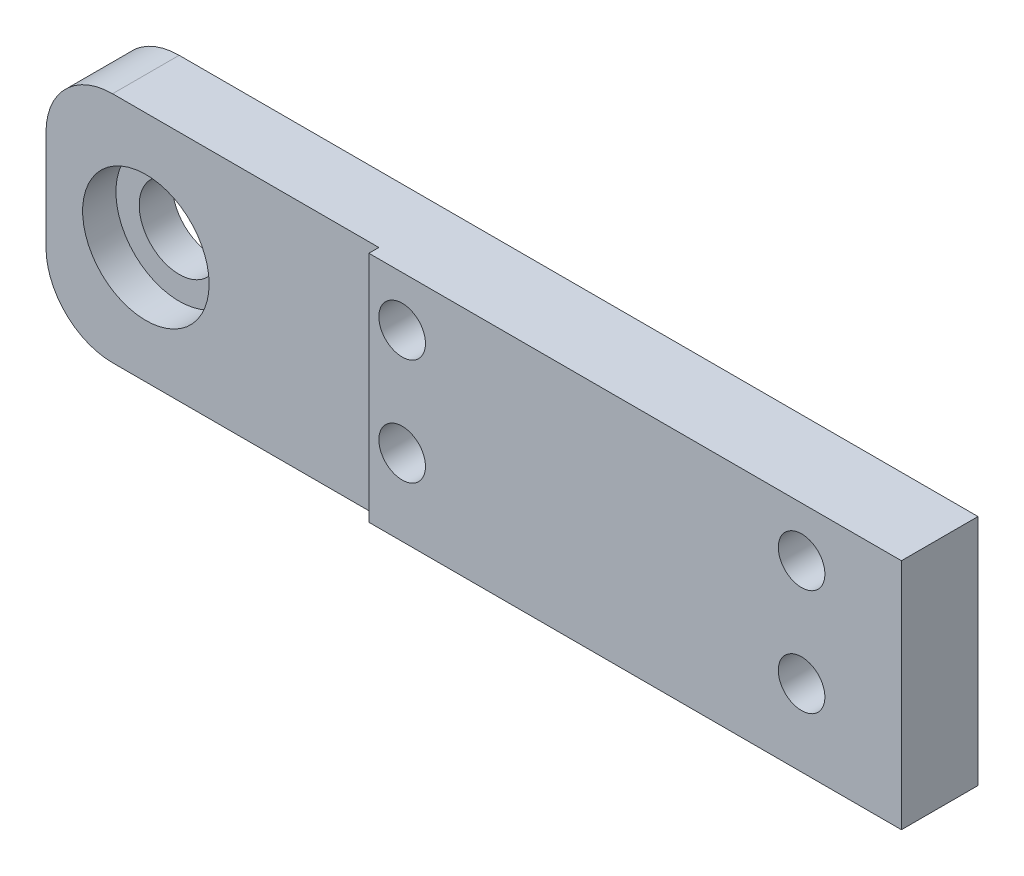
ISO-10303-21;
HEADER;
FILE_DESCRIPTION(('STEP AP214'),'2;1');
FILE_NAME('part.step','',(''),(''),'','','');
FILE_SCHEMA(('AUTOMOTIVE_DESIGN { 1 0 10303 214 1 1 1 1 }'));
ENDSEC;
DATA;
#1=APPLICATION_CONTEXT('core data for automotive mechanical design processes');
#2=APPLICATION_PROTOCOL_DEFINITION('international standard','automotive_design',2000,#1);
#3=PRODUCT_CONTEXT('',#1,'mechanical');
#4=PRODUCT('Part','Part','',(#3));
#5=PRODUCT_RELATED_PRODUCT_CATEGORY('part','',(#4));
#6=PRODUCT_DEFINITION_FORMATION('','',#4);
#7=PRODUCT_DEFINITION_CONTEXT('part definition',#1,'design');
#8=PRODUCT_DEFINITION('design','',#6,#7);
#9=PRODUCT_DEFINITION_SHAPE('','',#8);
#10=(LENGTH_UNIT() NAMED_UNIT(*) SI_UNIT(.MILLI.,.METRE.));
#11=(NAMED_UNIT(*) PLANE_ANGLE_UNIT() SI_UNIT($,.RADIAN.));
#12=(NAMED_UNIT(*) SI_UNIT($,.STERADIAN.) SOLID_ANGLE_UNIT());
#13=UNCERTAINTY_MEASURE_WITH_UNIT(LENGTH_MEASURE(1.E-05),#10,'distance_accuracy_value','');
#14=(GEOMETRIC_REPRESENTATION_CONTEXT(3) GLOBAL_UNCERTAINTY_ASSIGNED_CONTEXT((#13)) GLOBAL_UNIT_ASSIGNED_CONTEXT((#10,
#11,#12)) REPRESENTATION_CONTEXT('',''));
#15=CARTESIAN_POINT('',(0.,0.,0.));
#16=DIRECTION('',(0.,0.,1.));
#17=DIRECTION('',(1.,0.,0.));
#18=AXIS2_PLACEMENT_3D('',#15,#16,#17);
#19=CARTESIAN_POINT('',(0.,35.,10.));
#20=DIRECTION('',(0.,0.,-1.));
#21=DIRECTION('',(-1.,0.,0.));
#22=AXIS2_PLACEMENT_3D('',#19,#20,#21);
#23=PLANE('',#22);
#24=CARTESIAN_POINT('',(15.,17.5,10.));
#25=DIRECTION('',(0.,0.,1.));
#26=DIRECTION('',(1.,0.,0.));
#27=AXIS2_PLACEMENT_3D('',#24,#25,#26);
#28=CIRCLE('',#27,9.5);
#29=CARTESIAN_POINT('',(24.5,17.5,10.));
#30=VERTEX_POINT('',#29);
#31=EDGE_CURVE('E296',#30,#30,#28,.T.);
#32=ORIENTED_EDGE('',*,*,#31,.F.);
#33=EDGE_LOOP('',(#32));
#34=FACE_BOUND('',#33,.T.);
#35=DIRECTION('',(0.,-1.,0.));
#36=VECTOR('',#35,1.);
#37=CARTESIAN_POINT('',(50.,0.,10.));
#38=LINE('',#37,#36);
#39=CARTESIAN_POINT('',(50.,35.,10.));
#40=VERTEX_POINT('',#39);
#41=CARTESIAN_POINT('',(50.,0.,10.));
#42=VERTEX_POINT('',#41);
#43=EDGE_CURVE('E64',#40,#42,#38,.T.);
#44=ORIENTED_EDGE('',*,*,#43,.F.);
#45=DIRECTION('',(-1.,0.,0.));
#46=VECTOR('',#45,1.);
#47=CARTESIAN_POINT('',(0.,35.,10.));
#48=LINE('',#47,#46);
#49=CARTESIAN_POINT('',(10.,35.,10.));
#50=VERTEX_POINT('',#49);
#51=EDGE_CURVE('E126',#40,#50,#48,.T.);
#52=ORIENTED_EDGE('',*,*,#51,.T.);
#53=CARTESIAN_POINT('',(10.,25.,10.));
#54=DIRECTION('',(0.,0.,-1.));
#55=DIRECTION('',(-1.,0.,0.));
#56=AXIS2_PLACEMENT_3D('',#53,#54,#55);
#57=CIRCLE('',#56,10.);
#58=CARTESIAN_POINT('',(0.,25.,10.));
#59=VERTEX_POINT('',#58);
#60=EDGE_CURVE('E56',#50,#59,#57,.F.);
#61=ORIENTED_EDGE('',*,*,#60,.T.);
#62=DIRECTION('',(0.,-1.,0.));
#63=VECTOR('',#62,1.);
#64=CARTESIAN_POINT('',(0.,0.,10.));
#65=LINE('',#64,#63);
#66=CARTESIAN_POINT('',(0.,10.,10.));
#67=VERTEX_POINT('',#66);
#68=EDGE_CURVE('E282',#59,#67,#65,.T.);
#69=ORIENTED_EDGE('',*,*,#68,.T.);
#70=CARTESIAN_POINT('',(10.,10.,10.));
#71=DIRECTION('',(0.,0.,-1.));
#72=DIRECTION('',(-1.,0.,0.));
#73=AXIS2_PLACEMENT_3D('',#70,#71,#72);
#74=CIRCLE('',#73,10.);
#75=CARTESIAN_POINT('',(10.,0.,10.));
#76=VERTEX_POINT('',#75);
#77=EDGE_CURVE('E70',#67,#76,#74,.F.);
#78=ORIENTED_EDGE('',*,*,#77,.T.);
#79=DIRECTION('',(1.,0.,0.));
#80=VECTOR('',#79,1.);
#81=CARTESIAN_POINT('',(0.,0.,10.));
#82=LINE('',#81,#80);
#83=EDGE_CURVE('E157',#76,#42,#82,.T.);
#84=ORIENTED_EDGE('',*,*,#83,.T.);
#85=EDGE_LOOP('',(#44,#52,#61,#69,#78,#84));
#86=FACE_BOUND('',#85,.T.);
#87=ADVANCED_FACE('F47',(#34,#86),#23,.F.);
#88=CARTESIAN_POINT('',(0.,0.,10.));
#89=DIRECTION('',(1.,0.,0.));
#90=DIRECTION('',(0.,0.,-1.));
#91=AXIS2_PLACEMENT_3D('',#88,#89,#90);
#92=PLANE('',#91);
#93=ORIENTED_EDGE('',*,*,#68,.F.);
#94=DIRECTION('',(0.,0.,-1.));
#95=VECTOR('',#94,1.);
#96=CARTESIAN_POINT('',(0.,25.,10.));
#97=LINE('',#96,#95);
#98=CARTESIAN_POINT('',(0.,25.,0.));
#99=VERTEX_POINT('',#98);
#100=EDGE_CURVE('E264',#59,#99,#97,.T.);
#101=ORIENTED_EDGE('',*,*,#100,.T.);
#102=DIRECTION('',(0.,-1.,0.));
#103=VECTOR('',#102,1.);
#104=CARTESIAN_POINT('',(0.,0.,0.));
#105=LINE('',#104,#103);
#106=CARTESIAN_POINT('',(0.,10.,0.));
#107=VERTEX_POINT('',#106);
#108=EDGE_CURVE('E274',#99,#107,#105,.T.);
#109=ORIENTED_EDGE('',*,*,#108,.T.);
#110=DIRECTION('',(0.,0.,-1.));
#111=VECTOR('',#110,1.);
#112=CARTESIAN_POINT('',(0.,10.,10.));
#113=LINE('',#112,#111);
#114=EDGE_CURVE('E285',#107,#67,#113,.F.);
#115=ORIENTED_EDGE('',*,*,#114,.T.);
#116=EDGE_LOOP('',(#93,#101,#109,#115));
#117=FACE_BOUND('',#116,.T.);
#118=ADVANCED_FACE('F221',(#117),#92,.F.);
#119=CARTESIAN_POINT('',(0.,0.,10.));
#120=DIRECTION('',(0.,1.,0.));
#121=DIRECTION('',(0.,0.,1.));
#122=AXIS2_PLACEMENT_3D('',#119,#120,#121);
#123=PLANE('',#122);
#124=ORIENTED_EDGE('',*,*,#83,.F.);
#125=DIRECTION('',(0.,0.,-1.));
#126=VECTOR('',#125,1.);
#127=CARTESIAN_POINT('',(10.,0.,10.));
#128=LINE('',#127,#126);
#129=CARTESIAN_POINT('',(10.,0.,0.));
#130=VERTEX_POINT('',#129);
#131=EDGE_CURVE('E13',#76,#130,#128,.T.);
#132=ORIENTED_EDGE('',*,*,#131,.T.);
#133=DIRECTION('',(1.,0.,0.));
#134=VECTOR('',#133,1.);
#135=CARTESIAN_POINT('',(0.,0.,0.));
#136=LINE('',#135,#134);
#137=CARTESIAN_POINT('',(130.,0.,0.));
#138=VERTEX_POINT('',#137);
#139=EDGE_CURVE('E277',#130,#138,#136,.T.);
#140=ORIENTED_EDGE('',*,*,#139,.T.);
#141=DIRECTION('',(0.,0.,-1.));
#142=VECTOR('',#141,1.);
#143=CARTESIAN_POINT('',(130.,0.,10.));
#144=LINE('',#143,#142);
#145=CARTESIAN_POINT('',(130.,0.,11.5));
#146=VERTEX_POINT('',#145);
#147=EDGE_CURVE('E125',#146,#138,#144,.T.);
#148=ORIENTED_EDGE('',*,*,#147,.F.);
#149=DIRECTION('',(1.,0.,0.));
#150=VECTOR('',#149,1.);
#151=CARTESIAN_POINT('',(130.,0.,11.5));
#152=LINE('',#151,#150);
#153=CARTESIAN_POINT('',(50.,0.,11.5));
#154=VERTEX_POINT('',#153);
#155=EDGE_CURVE('E140',#154,#146,#152,.T.);
#156=ORIENTED_EDGE('',*,*,#155,.F.);
#157=DIRECTION('',(0.,0.,-1.));
#158=VECTOR('',#157,1.);
#159=CARTESIAN_POINT('',(50.,0.,11.5));
#160=LINE('',#159,#158);
#161=EDGE_CURVE('E150',#154,#42,#160,.T.);
#162=ORIENTED_EDGE('',*,*,#161,.T.);
#163=EDGE_LOOP('',(#124,#132,#140,#148,#156,#162));
#164=FACE_BOUND('',#163,.T.);
#165=ADVANCED_FACE('F227',(#164),#123,.F.);
#166=CARTESIAN_POINT('',(130.,0.,10.));
#167=DIRECTION('',(-1.,0.,0.));
#168=DIRECTION('',(0.,0.,1.));
#169=AXIS2_PLACEMENT_3D('',#166,#167,#168);
#170=PLANE('',#169);
#171=DIRECTION('',(0.,1.,0.));
#172=VECTOR('',#171,1.);
#173=CARTESIAN_POINT('',(130.,0.,0.));
#174=LINE('',#173,#172);
#175=CARTESIAN_POINT('',(130.,35.,0.));
#176=VERTEX_POINT('',#175);
#177=EDGE_CURVE('E121',#138,#176,#174,.T.);
#178=ORIENTED_EDGE('',*,*,#177,.T.);
#179=DIRECTION('',(0.,0.,-1.));
#180=VECTOR('',#179,1.);
#181=CARTESIAN_POINT('',(130.,35.,10.));
#182=LINE('',#181,#180);
#183=CARTESIAN_POINT('',(130.,35.,11.5));
#184=VERTEX_POINT('',#183);
#185=EDGE_CURVE('E114',#184,#176,#182,.T.);
#186=ORIENTED_EDGE('',*,*,#185,.F.);
#187=DIRECTION('',(0.,1.,0.));
#188=VECTOR('',#187,1.);
#189=CARTESIAN_POINT('',(130.,0.,11.5));
#190=LINE('',#189,#188);
#191=EDGE_CURVE('E119',#146,#184,#190,.T.);
#192=ORIENTED_EDGE('',*,*,#191,.F.);
#193=ORIENTED_EDGE('',*,*,#147,.T.);
#194=EDGE_LOOP('',(#178,#186,#192,#193));
#195=FACE_BOUND('',#194,.T.);
#196=ADVANCED_FACE('F116',(#195),#170,.F.);
#197=CARTESIAN_POINT('',(0.,35.,10.));
#198=DIRECTION('',(0.,-1.,0.));
#199=DIRECTION('',(0.,0.,-1.));
#200=AXIS2_PLACEMENT_3D('',#197,#198,#199);
#201=PLANE('',#200);
#202=DIRECTION('',(-1.,0.,0.));
#203=VECTOR('',#202,1.);
#204=CARTESIAN_POINT('',(0.,35.,0.));
#205=LINE('',#204,#203);
#206=CARTESIAN_POINT('',(10.,35.,0.));
#207=VERTEX_POINT('',#206);
#208=EDGE_CURVE('E281',#176,#207,#205,.T.);
#209=ORIENTED_EDGE('',*,*,#208,.T.);
#210=DIRECTION('',(0.,0.,-1.));
#211=VECTOR('',#210,1.);
#212=CARTESIAN_POINT('',(10.,35.,10.));
#213=LINE('',#212,#211);
#214=EDGE_CURVE('E262',#207,#50,#213,.F.);
#215=ORIENTED_EDGE('',*,*,#214,.T.);
#216=ORIENTED_EDGE('',*,*,#51,.F.);
#217=DIRECTION('',(0.,0.,-1.));
#218=VECTOR('',#217,1.);
#219=CARTESIAN_POINT('',(50.,35.,11.5));
#220=LINE('',#219,#218);
#221=CARTESIAN_POINT('',(50.,35.,11.5));
#222=VERTEX_POINT('',#221);
#223=EDGE_CURVE('E132',#222,#40,#220,.T.);
#224=ORIENTED_EDGE('',*,*,#223,.F.);
#225=DIRECTION('',(-1.,0.,0.));
#226=VECTOR('',#225,1.);
#227=CARTESIAN_POINT('',(130.,35.,11.5));
#228=LINE('',#227,#226);
#229=EDGE_CURVE('E129',#184,#222,#228,.T.);
#230=ORIENTED_EDGE('',*,*,#229,.F.);
#231=ORIENTED_EDGE('',*,*,#185,.T.);
#232=EDGE_LOOP('',(#209,#215,#216,#224,#230,#231));
#233=FACE_BOUND('',#232,.T.);
#234=ADVANCED_FACE('F130',(#233),#201,.F.);
#235=CARTESIAN_POINT('',(0.,35.,0.));
#236=DIRECTION('',(0.,0.,-1.));
#237=DIRECTION('',(-1.,0.,0.));
#238=AXIS2_PLACEMENT_3D('',#235,#236,#237);
#239=PLANE('',#238);
#240=CARTESIAN_POINT('',(115.,11.5000000000001,0.));
#241=DIRECTION('',(0.,0.,-1.));
#242=DIRECTION('',(-1.,0.,0.));
#243=AXIS2_PLACEMENT_3D('',#240,#241,#242);
#244=CIRCLE('',#243,5.49999999999999);
#245=CARTESIAN_POINT('',(109.5,11.5000000000001,0.));
#246=VERTEX_POINT('',#245);
#247=EDGE_CURVE('E502',#246,#246,#244,.T.);
#248=ORIENTED_EDGE('',*,*,#247,.F.);
#249=EDGE_LOOP('',(#248));
#250=FACE_BOUND('',#249,.T.);
#251=CARTESIAN_POINT('',(115.,27.5000000000001,0.));
#252=DIRECTION('',(0.,0.,-1.));
#253=DIRECTION('',(-1.,0.,0.));
#254=AXIS2_PLACEMENT_3D('',#251,#252,#253);
#255=CIRCLE('',#254,5.49999999999999);
#256=CARTESIAN_POINT('',(109.5,27.5000000000001,0.));
#257=VERTEX_POINT('',#256);
#258=EDGE_CURVE('E189',#257,#257,#255,.T.);
#259=ORIENTED_EDGE('',*,*,#258,.F.);
#260=EDGE_LOOP('',(#259));
#261=FACE_BOUND('',#260,.T.);
#262=CARTESIAN_POINT('',(55.,27.5000000000001,0.));
#263=DIRECTION('',(0.,0.,-1.));
#264=DIRECTION('',(-1.,0.,0.));
#265=AXIS2_PLACEMENT_3D('',#262,#263,#264);
#266=CIRCLE('',#265,5.49999999999999);
#267=CARTESIAN_POINT('',(49.5,27.5000000000001,0.));
#268=VERTEX_POINT('',#267);
#269=EDGE_CURVE('E176',#268,#268,#266,.T.);
#270=ORIENTED_EDGE('',*,*,#269,.F.);
#271=EDGE_LOOP('',(#270));
#272=FACE_BOUND('',#271,.T.);
#273=CARTESIAN_POINT('',(55.,11.5000000000001,0.));
#274=DIRECTION('',(0.,0.,-1.));
#275=DIRECTION('',(-1.,0.,0.));
#276=AXIS2_PLACEMENT_3D('',#273,#274,#275);
#277=CIRCLE('',#276,5.49999999999999);
#278=CARTESIAN_POINT('',(49.5,11.5000000000001,0.));
#279=VERTEX_POINT('',#278);
#280=EDGE_CURVE('E172',#279,#279,#277,.T.);
#281=ORIENTED_EDGE('',*,*,#280,.F.);
#282=EDGE_LOOP('',(#281));
#283=FACE_BOUND('',#282,.T.);
#284=CARTESIAN_POINT('',(15.,17.5,0.));
#285=DIRECTION('',(0.,0.,1.));
#286=DIRECTION('',(1.,0.,0.));
#287=AXIS2_PLACEMENT_3D('',#284,#285,#286);
#288=CIRCLE('',#287,6.);
#289=CARTESIAN_POINT('',(21.,17.5,0.));
#290=VERTEX_POINT('',#289);
#291=EDGE_CURVE('E153',#290,#290,#288,.T.);
#292=ORIENTED_EDGE('',*,*,#291,.T.);
#293=EDGE_LOOP('',(#292));
#294=FACE_BOUND('',#293,.T.);
#295=ORIENTED_EDGE('',*,*,#108,.F.);
#296=CARTESIAN_POINT('',(10.,25.,0.));
#297=DIRECTION('',(0.,0.,-1.));
#298=DIRECTION('',(-1.,0.,0.));
#299=AXIS2_PLACEMENT_3D('',#296,#297,#298);
#300=CIRCLE('',#299,10.);
#301=EDGE_CURVE('E290',#99,#207,#300,.T.);
#302=ORIENTED_EDGE('',*,*,#301,.T.);
#303=ORIENTED_EDGE('',*,*,#208,.F.);
#304=ORIENTED_EDGE('',*,*,#177,.F.);
#305=ORIENTED_EDGE('',*,*,#139,.F.);
#306=CARTESIAN_POINT('',(10.,10.,0.));
#307=DIRECTION('',(0.,0.,-1.));
#308=DIRECTION('',(-1.,0.,0.));
#309=AXIS2_PLACEMENT_3D('',#306,#307,#308);
#310=CIRCLE('',#309,10.);
#311=EDGE_CURVE('E288',#130,#107,#310,.T.);
#312=ORIENTED_EDGE('',*,*,#311,.T.);
#313=EDGE_LOOP('',(#295,#302,#303,#304,#305,#312));
#314=FACE_BOUND('',#313,.T.);
#315=ADVANCED_FACE('F235',(#250,#261,#272,#283,#294,#314),#239,.T.);
#316=CARTESIAN_POINT('',(15.,17.5,5.));
#317=DIRECTION('',(0.,0.,1.));
#318=DIRECTION('',(1.,0.,0.));
#319=AXIS2_PLACEMENT_3D('',#316,#317,#318);
#320=CYLINDRICAL_SURFACE('',#319,9.5);
#321=CARTESIAN_POINT('',(15.,17.5,5.));
#322=DIRECTION('',(0.,0.,1.));
#323=DIRECTION('',(1.,0.,0.));
#324=AXIS2_PLACEMENT_3D('',#321,#322,#323);
#325=CIRCLE('',#324,9.5);
#326=CARTESIAN_POINT('',(24.5,17.5,5.));
#327=VERTEX_POINT('',#326);
#328=EDGE_CURVE('E278',#327,#327,#325,.T.);
#329=ORIENTED_EDGE('',*,*,#328,.F.);
#330=EDGE_LOOP('',(#329));
#331=FACE_BOUND('',#330,.T.);
#332=ORIENTED_EDGE('',*,*,#31,.T.);
#333=EDGE_LOOP('',(#332));
#334=FACE_BOUND('',#333,.T.);
#335=ADVANCED_FACE('F233',(#331,#334),#320,.F.);
#336=CARTESIAN_POINT('',(15.,17.5,5.));
#337=DIRECTION('',(0.,0.,1.));
#338=DIRECTION('',(1.,0.,0.));
#339=AXIS2_PLACEMENT_3D('',#336,#337,#338);
#340=PLANE('',#339);
#341=CARTESIAN_POINT('',(15.,17.5,5.));
#342=DIRECTION('',(0.,0.,1.));
#343=DIRECTION('',(1.,0.,0.));
#344=AXIS2_PLACEMENT_3D('',#341,#342,#343);
#345=CIRCLE('',#344,6.);
#346=CARTESIAN_POINT('',(21.,17.5,5.));
#347=VERTEX_POINT('',#346);
#348=EDGE_CURVE('E165',#347,#347,#345,.T.);
#349=ORIENTED_EDGE('',*,*,#348,.F.);
#350=EDGE_LOOP('',(#349));
#351=FACE_BOUND('',#350,.T.);
#352=ORIENTED_EDGE('',*,*,#328,.T.);
#353=EDGE_LOOP('',(#352));
#354=FACE_BOUND('',#353,.T.);
#355=ADVANCED_FACE('F255',(#351,#354),#340,.T.);
#356=CARTESIAN_POINT('',(15.,17.5,0.));
#357=DIRECTION('',(0.,0.,1.));
#358=DIRECTION('',(1.,0.,0.));
#359=AXIS2_PLACEMENT_3D('',#356,#357,#358);
#360=CYLINDRICAL_SURFACE('',#359,6.);
#361=ORIENTED_EDGE('',*,*,#291,.F.);
#362=EDGE_LOOP('',(#361));
#363=FACE_BOUND('',#362,.T.);
#364=ORIENTED_EDGE('',*,*,#348,.T.);
#365=EDGE_LOOP('',(#364));
#366=FACE_BOUND('',#365,.T.);
#367=ADVANCED_FACE('F247',(#363,#366),#360,.F.);
#368=CARTESIAN_POINT('',(10.,25.,10.));
#369=DIRECTION('',(0.,0.,-1.));
#370=DIRECTION('',(-1.,0.,0.));
#371=AXIS2_PLACEMENT_3D('',#368,#369,#370);
#372=CYLINDRICAL_SURFACE('',#371,10.);
#373=ORIENTED_EDGE('',*,*,#60,.F.);
#374=ORIENTED_EDGE('',*,*,#214,.F.);
#375=ORIENTED_EDGE('',*,*,#301,.F.);
#376=ORIENTED_EDGE('',*,*,#100,.F.);
#377=EDGE_LOOP('',(#373,#374,#375,#376));
#378=FACE_BOUND('',#377,.T.);
#379=ADVANCED_FACE('F245',(#378),#372,.T.);
#380=CARTESIAN_POINT('',(10.,10.,10.));
#381=DIRECTION('',(0.,0.,-1.));
#382=DIRECTION('',(-1.,0.,0.));
#383=AXIS2_PLACEMENT_3D('',#380,#381,#382);
#384=CYLINDRICAL_SURFACE('',#383,10.);
#385=ORIENTED_EDGE('',*,*,#77,.F.);
#386=ORIENTED_EDGE('',*,*,#114,.F.);
#387=ORIENTED_EDGE('',*,*,#311,.F.);
#388=ORIENTED_EDGE('',*,*,#131,.F.);
#389=EDGE_LOOP('',(#385,#386,#387,#388));
#390=FACE_BOUND('',#389,.T.);
#391=ADVANCED_FACE('F49',(#390),#384,.T.);
#392=CARTESIAN_POINT('',(50.,0.,11.5));
#393=DIRECTION('',(1.,0.,0.));
#394=DIRECTION('',(0.,0.,-1.));
#395=AXIS2_PLACEMENT_3D('',#392,#393,#394);
#396=PLANE('',#395);
#397=ORIENTED_EDGE('',*,*,#43,.T.);
#398=ORIENTED_EDGE('',*,*,#161,.F.);
#399=DIRECTION('',(0.,-1.,0.));
#400=VECTOR('',#399,1.);
#401=CARTESIAN_POINT('',(50.,0.,11.5));
#402=LINE('',#401,#400);
#403=EDGE_CURVE('E135',#222,#154,#402,.T.);
#404=ORIENTED_EDGE('',*,*,#403,.F.);
#405=ORIENTED_EDGE('',*,*,#223,.T.);
#406=EDGE_LOOP('',(#397,#398,#404,#405));
#407=FACE_BOUND('',#406,.T.);
#408=ADVANCED_FACE('F253',(#407),#396,.F.);
#409=CARTESIAN_POINT('',(130.,35.,11.5));
#410=DIRECTION('',(0.,0.,1.));
#411=DIRECTION('',(1.,0.,0.));
#412=AXIS2_PLACEMENT_3D('',#409,#410,#411);
#413=PLANE('',#412);
#414=CARTESIAN_POINT('',(115.,11.5000000000001,11.5));
#415=DIRECTION('',(0.,0.,1.));
#416=DIRECTION('',(1.,0.,0.));
#417=AXIS2_PLACEMENT_3D('',#414,#415,#416);
#418=CIRCLE('',#417,3.50000000000001);
#419=CARTESIAN_POINT('',(118.5,11.5000000000001,11.5));
#420=VERTEX_POINT('',#419);
#421=EDGE_CURVE('E51',#420,#420,#418,.T.);
#422=ORIENTED_EDGE('',*,*,#421,.F.);
#423=EDGE_LOOP('',(#422));
#424=FACE_BOUND('',#423,.T.);
#425=CARTESIAN_POINT('',(115.,27.5000000000001,11.5));
#426=DIRECTION('',(0.,0.,1.));
#427=DIRECTION('',(1.,0.,0.));
#428=AXIS2_PLACEMENT_3D('',#425,#426,#427);
#429=CIRCLE('',#428,3.50000000000001);
#430=CARTESIAN_POINT('',(118.5,27.5000000000001,11.5));
#431=VERTEX_POINT('',#430);
#432=EDGE_CURVE('E174',#431,#431,#429,.T.);
#433=ORIENTED_EDGE('',*,*,#432,.F.);
#434=EDGE_LOOP('',(#433));
#435=FACE_BOUND('',#434,.T.);
#436=CARTESIAN_POINT('',(55.,27.5000000000001,11.5));
#437=DIRECTION('',(0.,0.,1.));
#438=DIRECTION('',(1.,0.,0.));
#439=AXIS2_PLACEMENT_3D('',#436,#437,#438);
#440=CIRCLE('',#439,3.5);
#441=CARTESIAN_POINT('',(58.5,27.5000000000001,11.5));
#442=VERTEX_POINT('',#441);
#443=EDGE_CURVE('E170',#442,#442,#440,.T.);
#444=ORIENTED_EDGE('',*,*,#443,.F.);
#445=EDGE_LOOP('',(#444));
#446=FACE_BOUND('',#445,.T.);
#447=CARTESIAN_POINT('',(55.,11.5000000000001,11.5));
#448=DIRECTION('',(0.,0.,1.));
#449=DIRECTION('',(1.,0.,0.));
#450=AXIS2_PLACEMENT_3D('',#447,#448,#449);
#451=CIRCLE('',#450,3.5);
#452=CARTESIAN_POINT('',(58.5,11.5000000000001,11.5));
#453=VERTEX_POINT('',#452);
#454=EDGE_CURVE('E142',#453,#453,#451,.T.);
#455=ORIENTED_EDGE('',*,*,#454,.F.);
#456=EDGE_LOOP('',(#455));
#457=FACE_BOUND('',#456,.T.);
#458=ORIENTED_EDGE('',*,*,#191,.T.);
#459=ORIENTED_EDGE('',*,*,#229,.T.);
#460=ORIENTED_EDGE('',*,*,#403,.T.);
#461=ORIENTED_EDGE('',*,*,#155,.T.);
#462=EDGE_LOOP('',(#458,#459,#460,#461));
#463=FACE_BOUND('',#462,.T.);
#464=ADVANCED_FACE('F138',(#424,#435,#446,#457,#463),#413,.T.);
#465=CARTESIAN_POINT('',(55.,11.5000000000001,0.));
#466=DIRECTION('',(0.,0.,-1.));
#467=DIRECTION('',(-1.,0.,0.));
#468=AXIS2_PLACEMENT_3D('',#465,#466,#467);
#469=CYLINDRICAL_SURFACE('',#468,3.5);
#470=ORIENTED_EDGE('',*,*,#454,.T.);
#471=EDGE_LOOP('',(#470));
#472=FACE_BOUND('',#471,.T.);
#473=CARTESIAN_POINT('',(55.,11.5000000000001,6.));
#474=DIRECTION('',(0.,0.,-1.));
#475=DIRECTION('',(-1.,0.,0.));
#476=AXIS2_PLACEMENT_3D('',#473,#474,#475);
#477=CIRCLE('',#476,3.50000000000001);
#478=CARTESIAN_POINT('',(51.5,11.5000000000001,6.));
#479=VERTEX_POINT('',#478);
#480=EDGE_CURVE('E145',#479,#479,#477,.T.);
#481=ORIENTED_EDGE('',*,*,#480,.T.);
#482=EDGE_LOOP('',(#481));
#483=FACE_BOUND('',#482,.T.);
#484=ADVANCED_FACE('F205',(#472,#483),#469,.F.);
#485=CARTESIAN_POINT('',(58.5,11.5000000000001,6.));
#486=DIRECTION('',(0.,0.,1.));
#487=DIRECTION('',(1.,0.,0.));
#488=AXIS2_PLACEMENT_3D('',#485,#486,#487);
#489=PLANE('',#488);
#490=ORIENTED_EDGE('',*,*,#480,.F.);
#491=EDGE_LOOP('',(#490));
#492=FACE_BOUND('',#491,.T.);
#493=CARTESIAN_POINT('',(55.,11.5000000000001,6.));
#494=DIRECTION('',(0.,0.,-1.));
#495=DIRECTION('',(-1.,0.,0.));
#496=AXIS2_PLACEMENT_3D('',#493,#494,#495);
#497=CIRCLE('',#496,5.49999999999999);
#498=CARTESIAN_POINT('',(49.5,11.5000000000001,6.));
#499=VERTEX_POINT('',#498);
#500=EDGE_CURVE('E198',#499,#499,#497,.T.);
#501=ORIENTED_EDGE('',*,*,#500,.T.);
#502=EDGE_LOOP('',(#501));
#503=FACE_BOUND('',#502,.T.);
#504=ADVANCED_FACE('F207',(#492,#503),#489,.F.);
#505=CARTESIAN_POINT('',(55.,11.5000000000001,0.));
#506=DIRECTION('',(0.,0.,-1.));
#507=DIRECTION('',(-1.,0.,0.));
#508=AXIS2_PLACEMENT_3D('',#505,#506,#507);
#509=CYLINDRICAL_SURFACE('',#508,5.49999999999999);
#510=ORIENTED_EDGE('',*,*,#500,.F.);
#511=EDGE_LOOP('',(#510));
#512=FACE_BOUND('',#511,.T.);
#513=ORIENTED_EDGE('',*,*,#280,.T.);
#514=EDGE_LOOP('',(#513));
#515=FACE_BOUND('',#514,.T.);
#516=ADVANCED_FACE('F209',(#512,#515),#509,.F.);
#517=CARTESIAN_POINT('',(55.,27.5000000000001,0.));
#518=DIRECTION('',(0.,0.,-1.));
#519=DIRECTION('',(-1.,0.,0.));
#520=AXIS2_PLACEMENT_3D('',#517,#518,#519);
#521=CYLINDRICAL_SURFACE('',#520,3.5);
#522=ORIENTED_EDGE('',*,*,#443,.T.);
#523=EDGE_LOOP('',(#522));
#524=FACE_BOUND('',#523,.T.);
#525=CARTESIAN_POINT('',(55.,27.5000000000001,6.));
#526=DIRECTION('',(0.,0.,-1.));
#527=DIRECTION('',(-1.,0.,0.));
#528=AXIS2_PLACEMENT_3D('',#525,#526,#527);
#529=CIRCLE('',#528,3.50000000000001);
#530=CARTESIAN_POINT('',(51.5,27.5000000000001,6.));
#531=VERTEX_POINT('',#530);
#532=EDGE_CURVE('E173',#531,#531,#529,.T.);
#533=ORIENTED_EDGE('',*,*,#532,.T.);
#534=EDGE_LOOP('',(#533));
#535=FACE_BOUND('',#534,.T.);
#536=ADVANCED_FACE('F215',(#524,#535),#521,.F.);
#537=CARTESIAN_POINT('',(58.5,27.5000000000001,6.));
#538=DIRECTION('',(0.,0.,1.));
#539=DIRECTION('',(1.,0.,0.));
#540=AXIS2_PLACEMENT_3D('',#537,#538,#539);
#541=PLANE('',#540);
#542=ORIENTED_EDGE('',*,*,#532,.F.);
#543=EDGE_LOOP('',(#542));
#544=FACE_BOUND('',#543,.T.);
#545=CARTESIAN_POINT('',(55.,27.5000000000001,6.));
#546=DIRECTION('',(0.,0.,-1.));
#547=DIRECTION('',(-1.,0.,0.));
#548=AXIS2_PLACEMENT_3D('',#545,#546,#547);
#549=CIRCLE('',#548,5.49999999999999);
#550=CARTESIAN_POINT('',(49.5,27.5000000000001,6.));
#551=VERTEX_POINT('',#550);
#552=EDGE_CURVE('E181',#551,#551,#549,.T.);
#553=ORIENTED_EDGE('',*,*,#552,.T.);
#554=EDGE_LOOP('',(#553));
#555=FACE_BOUND('',#554,.T.);
#556=ADVANCED_FACE('F413',(#544,#555),#541,.F.);
#557=CARTESIAN_POINT('',(55.,27.5000000000001,0.));
#558=DIRECTION('',(0.,0.,-1.));
#559=DIRECTION('',(-1.,0.,0.));
#560=AXIS2_PLACEMENT_3D('',#557,#558,#559);
#561=CYLINDRICAL_SURFACE('',#560,5.49999999999999);
#562=ORIENTED_EDGE('',*,*,#552,.F.);
#563=EDGE_LOOP('',(#562));
#564=FACE_BOUND('',#563,.T.);
#565=ORIENTED_EDGE('',*,*,#269,.T.);
#566=EDGE_LOOP('',(#565));
#567=FACE_BOUND('',#566,.T.);
#568=ADVANCED_FACE('F423',(#564,#567),#561,.F.);
#569=CARTESIAN_POINT('',(115.,27.5000000000001,0.));
#570=DIRECTION('',(0.,0.,-1.));
#571=DIRECTION('',(-1.,0.,0.));
#572=AXIS2_PLACEMENT_3D('',#569,#570,#571);
#573=CYLINDRICAL_SURFACE('',#572,3.50000000000001);
#574=ORIENTED_EDGE('',*,*,#432,.T.);
#575=EDGE_LOOP('',(#574));
#576=FACE_BOUND('',#575,.T.);
#577=CARTESIAN_POINT('',(115.,27.5000000000001,6.));
#578=DIRECTION('',(0.,0.,-1.));
#579=DIRECTION('',(-1.,0.,0.));
#580=AXIS2_PLACEMENT_3D('',#577,#578,#579);
#581=CIRCLE('',#580,3.50000000000002);
#582=CARTESIAN_POINT('',(111.5,27.5000000000001,6.));
#583=VERTEX_POINT('',#582);
#584=EDGE_CURVE('E177',#583,#583,#581,.T.);
#585=ORIENTED_EDGE('',*,*,#584,.T.);
#586=EDGE_LOOP('',(#585));
#587=FACE_BOUND('',#586,.T.);
#588=ADVANCED_FACE('F433',(#576,#587),#573,.F.);
#589=CARTESIAN_POINT('',(118.5,27.5000000000001,6.));
#590=DIRECTION('',(0.,0.,1.));
#591=DIRECTION('',(1.,0.,0.));
#592=AXIS2_PLACEMENT_3D('',#589,#590,#591);
#593=PLANE('',#592);
#594=ORIENTED_EDGE('',*,*,#584,.F.);
#595=EDGE_LOOP('',(#594));
#596=FACE_BOUND('',#595,.T.);
#597=CARTESIAN_POINT('',(115.,27.5000000000001,6.));
#598=DIRECTION('',(0.,0.,-1.));
#599=DIRECTION('',(-1.,0.,0.));
#600=AXIS2_PLACEMENT_3D('',#597,#598,#599);
#601=CIRCLE('',#600,5.49999999999999);
#602=CARTESIAN_POINT('',(109.5,27.5000000000001,6.));
#603=VERTEX_POINT('',#602);
#604=EDGE_CURVE('E184',#603,#603,#601,.T.);
#605=ORIENTED_EDGE('',*,*,#604,.T.);
#606=EDGE_LOOP('',(#605));
#607=FACE_BOUND('',#606,.T.);
#608=ADVANCED_FACE('F443',(#596,#607),#593,.F.);
#609=CARTESIAN_POINT('',(115.,27.5000000000001,0.));
#610=DIRECTION('',(0.,0.,-1.));
#611=DIRECTION('',(-1.,0.,0.));
#612=AXIS2_PLACEMENT_3D('',#609,#610,#611);
#613=CYLINDRICAL_SURFACE('',#612,5.49999999999999);
#614=ORIENTED_EDGE('',*,*,#604,.F.);
#615=EDGE_LOOP('',(#614));
#616=FACE_BOUND('',#615,.T.);
#617=ORIENTED_EDGE('',*,*,#258,.T.);
#618=EDGE_LOOP('',(#617));
#619=FACE_BOUND('',#618,.T.);
#620=ADVANCED_FACE('F452',(#616,#619),#613,.F.);
#621=CARTESIAN_POINT('',(115.,11.5000000000001,0.));
#622=DIRECTION('',(0.,0.,-1.));
#623=DIRECTION('',(-1.,0.,0.));
#624=AXIS2_PLACEMENT_3D('',#621,#622,#623);
#625=CYLINDRICAL_SURFACE('',#624,3.50000000000001);
#626=ORIENTED_EDGE('',*,*,#421,.T.);
#627=EDGE_LOOP('',(#626));
#628=FACE_BOUND('',#627,.T.);
#629=CARTESIAN_POINT('',(115.,11.5000000000001,6.));
#630=DIRECTION('',(0.,0.,-1.));
#631=DIRECTION('',(-1.,0.,0.));
#632=AXIS2_PLACEMENT_3D('',#629,#630,#631);
#633=CIRCLE('',#632,3.50000000000002);
#634=CARTESIAN_POINT('',(111.5,11.5000000000001,6.));
#635=VERTEX_POINT('',#634);
#636=EDGE_CURVE('E504',#635,#635,#633,.T.);
#637=ORIENTED_EDGE('',*,*,#636,.T.);
#638=EDGE_LOOP('',(#637));
#639=FACE_BOUND('',#638,.T.);
#640=ADVANCED_FACE('F462',(#628,#639),#625,.F.);
#641=CARTESIAN_POINT('',(118.5,11.5000000000001,6.));
#642=DIRECTION('',(0.,0.,1.));
#643=DIRECTION('',(1.,0.,0.));
#644=AXIS2_PLACEMENT_3D('',#641,#642,#643);
#645=PLANE('',#644);
#646=ORIENTED_EDGE('',*,*,#636,.F.);
#647=EDGE_LOOP('',(#646));
#648=FACE_BOUND('',#647,.T.);
#649=CARTESIAN_POINT('',(115.,11.5000000000001,6.));
#650=DIRECTION('',(0.,0.,-1.));
#651=DIRECTION('',(-1.,0.,0.));
#652=AXIS2_PLACEMENT_3D('',#649,#650,#651);
#653=CIRCLE('',#652,5.49999999999999);
#654=CARTESIAN_POINT('',(109.5,11.5000000000001,6.));
#655=VERTEX_POINT('',#654);
#656=EDGE_CURVE('E499',#655,#655,#653,.T.);
#657=ORIENTED_EDGE('',*,*,#656,.T.);
#658=EDGE_LOOP('',(#657));
#659=FACE_BOUND('',#658,.T.);
#660=ADVANCED_FACE('F472',(#648,#659),#645,.F.);
#661=CARTESIAN_POINT('',(115.,11.5000000000001,0.));
#662=DIRECTION('',(0.,0.,-1.));
#663=DIRECTION('',(-1.,0.,0.));
#664=AXIS2_PLACEMENT_3D('',#661,#662,#663);
#665=CYLINDRICAL_SURFACE('',#664,5.49999999999999);
#666=ORIENTED_EDGE('',*,*,#656,.F.);
#667=EDGE_LOOP('',(#666));
#668=FACE_BOUND('',#667,.T.);
#669=ORIENTED_EDGE('',*,*,#247,.T.);
#670=EDGE_LOOP('',(#669));
#671=FACE_BOUND('',#670,.T.);
#672=ADVANCED_FACE('F482',(#668,#671),#665,.F.);
#673=CLOSED_SHELL('',(#87,#118,#165,#196,#234,#315,#335,#355,#367,#379,#391,#408,#464,#484,#504,
#516,#536,#556,#568,#588,#608,#620,#640,#660,#672));
#674=MANIFOLD_SOLID_BREP('B2',#673);
#675=ADVANCED_BREP_SHAPE_REPRESENTATION('',(#18,#674),#14);
#676=SHAPE_DEFINITION_REPRESENTATION(#9,#675);
ENDSEC;
END-ISO-10303-21;
